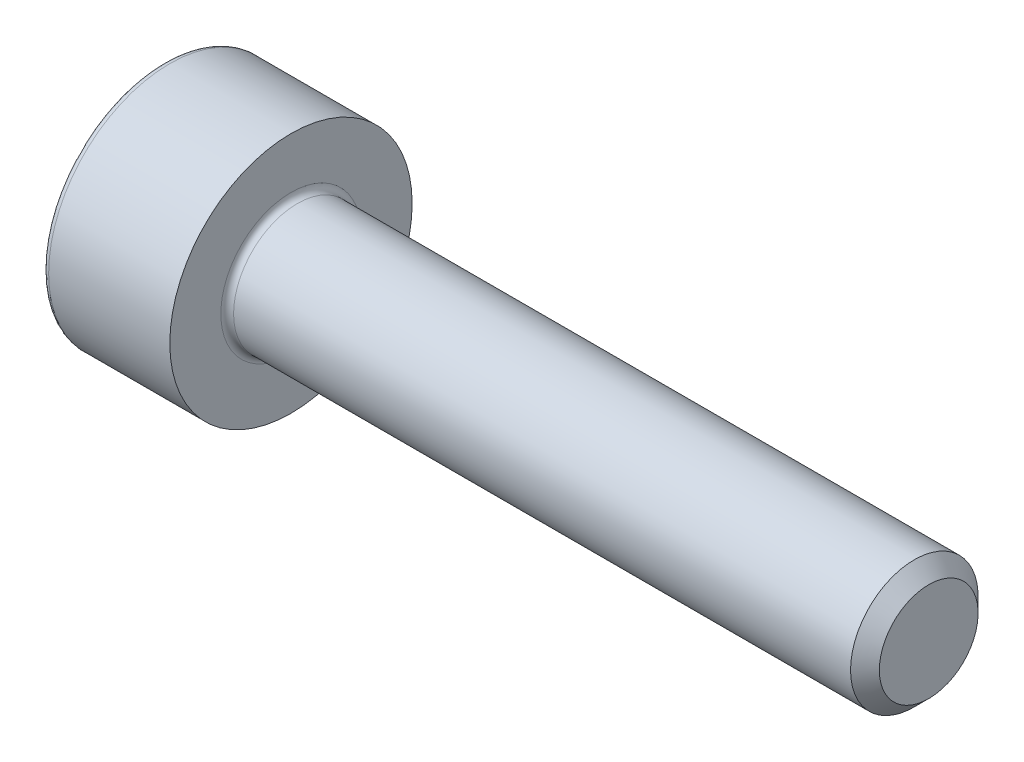
ISO-10303-21;
HEADER;
FILE_DESCRIPTION(('STEP AP214'),'2;1');
FILE_NAME('part.step','',(''),(''),'','','');
FILE_SCHEMA(('AUTOMOTIVE_DESIGN { 1 0 10303 214 1 1 1 1 }'));
ENDSEC;
DATA;
#1=APPLICATION_CONTEXT('core data for automotive mechanical design processes');
#2=APPLICATION_PROTOCOL_DEFINITION('international standard','automotive_design',2000,#1);
#3=PRODUCT_CONTEXT('',#1,'mechanical');
#4=PRODUCT('Part','Part','',(#3));
#5=PRODUCT_RELATED_PRODUCT_CATEGORY('part','',(#4));
#6=PRODUCT_DEFINITION_FORMATION('','',#4);
#7=PRODUCT_DEFINITION_CONTEXT('part definition',#1,'design');
#8=PRODUCT_DEFINITION('design','',#6,#7);
#9=PRODUCT_DEFINITION_SHAPE('','',#8);
#10=(LENGTH_UNIT() NAMED_UNIT(*) SI_UNIT(.MILLI.,.METRE.));
#11=(NAMED_UNIT(*) PLANE_ANGLE_UNIT() SI_UNIT($,.RADIAN.));
#12=(NAMED_UNIT(*) SI_UNIT($,.STERADIAN.) SOLID_ANGLE_UNIT());
#13=UNCERTAINTY_MEASURE_WITH_UNIT(LENGTH_MEASURE(1.E-05),#10,'distance_accuracy_value','');
#14=(GEOMETRIC_REPRESENTATION_CONTEXT(3) GLOBAL_UNCERTAINTY_ASSIGNED_CONTEXT((#13)) GLOBAL_UNIT_ASSIGNED_CONTEXT((#10,
#11,#12)) REPRESENTATION_CONTEXT('',''));
#15=CARTESIAN_POINT('',(0.,0.,0.));
#16=DIRECTION('',(0.,0.,1.));
#17=DIRECTION('',(1.,0.,0.));
#18=AXIS2_PLACEMENT_3D('',#15,#16,#17);
#19=CARTESIAN_POINT('',(0.,0.,0.));
#20=DIRECTION('',(-1.,0.,0.));
#21=DIRECTION('',(0.,0.,1.));
#22=AXIS2_PLACEMENT_3D('',#19,#20,#21);
#23=PLANE('',#22);
#24=DIRECTION('',(0.,-0.499999999999999,0.866025403784439));
#25=VECTOR('',#24,1.);
#26=CARTESIAN_POINT('',(0.,0.892006165897972,0.));
#27=LINE('',#26,#25);
#28=CARTESIAN_POINT('',(0.,0.892006165897972,0.));
#29=VERTEX_POINT('',#28);
#30=CARTESIAN_POINT('',(0.,0.446003082948987,0.772499999999999));
#31=VERTEX_POINT('',#30);
#32=EDGE_CURVE('E479',#29,#31,#27,.T.);
#33=ORIENTED_EDGE('',*,*,#32,.T.);
#34=DIRECTION('',(0.,1.,0.));
#35=VECTOR('',#34,1.);
#36=CARTESIAN_POINT('',(0.,-0.446003082948984,0.7725));
#37=LINE('',#36,#35);
#38=CARTESIAN_POINT('',(0.,-0.446003082948984,0.7725));
#39=VERTEX_POINT('',#38);
#40=EDGE_CURVE('E137',#39,#31,#37,.T.);
#41=ORIENTED_EDGE('',*,*,#40,.F.);
#42=DIRECTION('',(0.,-0.500000000000001,-0.866025403784438));
#43=VECTOR('',#42,1.);
#44=CARTESIAN_POINT('',(0.,-0.446003082948984,0.7725));
#45=LINE('',#44,#43);
#46=CARTESIAN_POINT('',(0.,-0.892006165897971,0.));
#47=VERTEX_POINT('',#46);
#48=EDGE_CURVE('E482',#39,#47,#45,.T.);
#49=ORIENTED_EDGE('',*,*,#48,.T.);
#50=DIRECTION('',(0.,0.499999999999997,-0.86602540378444));
#51=VECTOR('',#50,1.);
#52=CARTESIAN_POINT('',(0.,-0.892006165897971,0.));
#53=LINE('',#52,#51);
#54=CARTESIAN_POINT('',(0.,-0.446003082948987,-0.772500000000001));
#55=VERTEX_POINT('',#54);
#56=EDGE_CURVE('E485',#47,#55,#53,.T.);
#57=ORIENTED_EDGE('',*,*,#56,.T.);
#58=DIRECTION('',(0.,-1.,0.));
#59=VECTOR('',#58,1.);
#60=CARTESIAN_POINT('',(0.,0.446003082948986,-0.772500000000001));
#61=LINE('',#60,#59);
#62=CARTESIAN_POINT('',(0.,0.446003082948986,-0.772500000000001));
#63=VERTEX_POINT('',#62);
#64=EDGE_CURVE('E488',#63,#55,#61,.T.);
#65=ORIENTED_EDGE('',*,*,#64,.F.);
#66=DIRECTION('',(0.,-0.500000000000001,-0.866025403784438));
#67=VECTOR('',#66,1.);
#68=CARTESIAN_POINT('',(0.,0.892006165897972,0.));
#69=LINE('',#68,#67);
#70=EDGE_CURVE('E132',#29,#63,#69,.T.);
#71=ORIENTED_EDGE('',*,*,#70,.F.);
#72=EDGE_LOOP('',(#33,#41,#49,#57,#65,#71));
#73=FACE_BOUND('',#72,.T.);
#74=CARTESIAN_POINT('',(0.,0.,0.));
#75=DIRECTION('',(-1.,0.,0.));
#76=DIRECTION('',(0.,0.,1.));
#77=AXIS2_PLACEMENT_3D('',#74,#75,#76);
#78=CIRCLE('',#77,1.8);
#79=CARTESIAN_POINT('',(0.,0.,1.8));
#80=VERTEX_POINT('',#79);
#81=EDGE_CURVE('E49',#80,#80,#78,.T.);
#82=ORIENTED_EDGE('',*,*,#81,.T.);
#83=EDGE_LOOP('',(#82));
#84=FACE_BOUND('',#83,.T.);
#85=ADVANCED_FACE('F41',(#73,#84),#23,.T.);
#86=CARTESIAN_POINT('',(12.,0.774,0.));
#87=DIRECTION('',(1.,0.,0.));
#88=DIRECTION('',(0.,0.,-1.));
#89=AXIS2_PLACEMENT_3D('',#86,#87,#88);
#90=PLANE('',#89);
#91=CARTESIAN_POINT('',(12.,0.,0.));
#92=DIRECTION('',(-1.,0.,0.));
#93=DIRECTION('',(0.,0.,1.));
#94=AXIS2_PLACEMENT_3D('',#91,#92,#93);
#95=CIRCLE('',#94,0.774);
#96=CARTESIAN_POINT('',(12.,0.,0.774));
#97=VERTEX_POINT('',#96);
#98=EDGE_CURVE('E155',#97,#97,#95,.T.);
#99=ORIENTED_EDGE('',*,*,#98,.F.);
#100=EDGE_LOOP('',(#99));
#101=FACE_BOUND('',#100,.T.);
#102=ADVANCED_FACE('F179',(#101),#90,.T.);
#103=CARTESIAN_POINT('',(12.,0.,0.));
#104=DIRECTION('',(-1.,0.,0.));
#105=DIRECTION('',(0.,0.,1.));
#106=AXIS2_PLACEMENT_3D('',#103,#104,#105);
#107=CONICAL_SURFACE('',#106,0.774,0.785398163397475);
#108=CARTESIAN_POINT('',(11.774,0.,0.));
#109=DIRECTION('',(-1.,0.,0.));
#110=DIRECTION('',(0.,0.,1.));
#111=AXIS2_PLACEMENT_3D('',#108,#109,#110);
#112=CIRCLE('',#111,1.);
#113=CARTESIAN_POINT('',(11.774,0.,1.));
#114=VERTEX_POINT('',#113);
#115=EDGE_CURVE('E152',#114,#114,#112,.T.);
#116=ORIENTED_EDGE('',*,*,#115,.F.);
#117=EDGE_LOOP('',(#116));
#118=FACE_BOUND('',#117,.T.);
#119=ORIENTED_EDGE('',*,*,#98,.T.);
#120=EDGE_LOOP('',(#119));
#121=FACE_BOUND('',#120,.T.);
#122=ADVANCED_FACE('F185',(#118,#121),#107,.T.);
#123=CARTESIAN_POINT('',(-31.75,0.,0.));
#124=DIRECTION('',(-1.,0.,0.));
#125=DIRECTION('',(0.,0.,1.));
#126=AXIS2_PLACEMENT_3D('',#123,#124,#125);
#127=CYLINDRICAL_SURFACE('',#126,1.);
#128=CARTESIAN_POINT('',(2.1,0.,0.));
#129=DIRECTION('',(1.,0.,0.));
#130=DIRECTION('',(0.,0.,-1.));
#131=AXIS2_PLACEMENT_3D('',#128,#129,#130);
#132=CIRCLE('',#131,1.);
#133=CARTESIAN_POINT('',(2.1,0.,-1.));
#134=VERTEX_POINT('',#133);
#135=EDGE_CURVE('E161',#134,#134,#132,.T.);
#136=ORIENTED_EDGE('',*,*,#135,.T.);
#137=EDGE_LOOP('',(#136));
#138=FACE_BOUND('',#137,.T.);
#139=ORIENTED_EDGE('',*,*,#115,.T.);
#140=EDGE_LOOP('',(#139));
#141=FACE_BOUND('',#140,.T.);
#142=ADVANCED_FACE('F197',(#138,#141),#127,.T.);
#143=CARTESIAN_POINT('',(2.00000000000001,1.9,0.));
#144=DIRECTION('',(1.,0.,0.));
#145=DIRECTION('',(0.,0.,-1.));
#146=AXIS2_PLACEMENT_3D('',#143,#144,#145);
#147=PLANE('',#146);
#148=CARTESIAN_POINT('',(2.00000000000001,0.,0.));
#149=DIRECTION('',(1.,0.,0.));
#150=DIRECTION('',(0.,0.,-1.));
#151=AXIS2_PLACEMENT_3D('',#148,#149,#150);
#152=CIRCLE('',#151,1.1);
#153=CARTESIAN_POINT('',(2.00000000000001,0.,-1.1));
#154=VERTEX_POINT('',#153);
#155=EDGE_CURVE('E158',#154,#154,#152,.F.);
#156=ORIENTED_EDGE('',*,*,#155,.T.);
#157=EDGE_LOOP('',(#156));
#158=FACE_BOUND('',#157,.T.);
#159=CARTESIAN_POINT('',(2.,0.,0.));
#160=DIRECTION('',(-1.,0.,0.));
#161=DIRECTION('',(0.,0.,1.));
#162=AXIS2_PLACEMENT_3D('',#159,#160,#161);
#163=CIRCLE('',#162,1.9);
#164=CARTESIAN_POINT('',(2.,0.,1.9));
#165=VERTEX_POINT('',#164);
#166=EDGE_CURVE('E148',#165,#165,#163,.T.);
#167=ORIENTED_EDGE('',*,*,#166,.F.);
#168=EDGE_LOOP('',(#167));
#169=FACE_BOUND('',#168,.T.);
#170=ADVANCED_FACE('F193',(#158,#169),#147,.T.);
#171=CARTESIAN_POINT('',(-31.75,0.,0.));
#172=DIRECTION('',(-1.,0.,0.));
#173=DIRECTION('',(0.,0.,1.));
#174=AXIS2_PLACEMENT_3D('',#171,#172,#173);
#175=CYLINDRICAL_SURFACE('',#174,1.9);
#176=CARTESIAN_POINT('',(0.100000000000003,0.,0.));
#177=DIRECTION('',(-1.,0.,0.));
#178=DIRECTION('',(0.,0.,1.));
#179=AXIS2_PLACEMENT_3D('',#176,#177,#178);
#180=CIRCLE('',#179,1.9);
#181=CARTESIAN_POINT('',(0.100000000000003,0.,1.9));
#182=VERTEX_POINT('',#181);
#183=EDGE_CURVE('E11',#182,#182,#180,.F.);
#184=ORIENTED_EDGE('',*,*,#183,.T.);
#185=EDGE_LOOP('',(#184));
#186=FACE_BOUND('',#185,.T.);
#187=ORIENTED_EDGE('',*,*,#166,.T.);
#188=EDGE_LOOP('',(#187));
#189=FACE_BOUND('',#188,.T.);
#190=ADVANCED_FACE('F175',(#186,#189),#175,.T.);
#191=CARTESIAN_POINT('',(2.1,0.,0.));
#192=DIRECTION('',(1.,0.,0.));
#193=DIRECTION('',(0.,0.,-1.));
#194=AXIS2_PLACEMENT_3D('',#191,#192,#193);
#195=TOROIDAL_SURFACE('',#194,1.1,0.1);
#196=ORIENTED_EDGE('',*,*,#135,.F.);
#197=EDGE_LOOP('',(#196));
#198=FACE_BOUND('',#197,.T.);
#199=ORIENTED_EDGE('',*,*,#155,.F.);
#200=EDGE_LOOP('',(#199));
#201=FACE_BOUND('',#200,.T.);
#202=ADVANCED_FACE('F168',(#198,#201),#195,.F.);
#203=CARTESIAN_POINT('',(0.100000000000003,0.,0.));
#204=DIRECTION('',(-1.,0.,0.));
#205=DIRECTION('',(0.,0.,1.));
#206=AXIS2_PLACEMENT_3D('',#203,#204,#205);
#207=TOROIDAL_SURFACE('',#206,1.8,0.1);
#208=ORIENTED_EDGE('',*,*,#183,.F.);
#209=EDGE_LOOP('',(#208));
#210=FACE_BOUND('',#209,.T.);
#211=ORIENTED_EDGE('',*,*,#81,.F.);
#212=EDGE_LOOP('',(#211));
#213=FACE_BOUND('',#212,.T.);
#214=ADVANCED_FACE('F43',(#210,#213),#207,.T.);
#215=CARTESIAN_POINT('',(1.,0.892006165897972,0.));
#216=DIRECTION('',(0.,-0.866025403784439,-0.499999999999999));
#217=DIRECTION('',(0.,0.499999999999999,-0.866025403784439));
#218=AXIS2_PLACEMENT_3D('',#215,#216,#217);
#219=PLANE('',#218);
#220=ORIENTED_EDGE('',*,*,#32,.F.);
#221=DIRECTION('',(-1.,0.,0.));
#222=VECTOR('',#221,1.);
#223=CARTESIAN_POINT('',(1.,0.892006165897972,0.));
#224=LINE('',#223,#222);
#225=CARTESIAN_POINT('',(1.,0.892006165897972,0.));
#226=VERTEX_POINT('',#225);
#227=EDGE_CURVE('E478',#226,#29,#224,.T.);
#228=ORIENTED_EDGE('',*,*,#227,.F.);
#229=DIRECTION('',(0.,-0.499999999999999,0.866025403784439));
#230=VECTOR('',#229,1.);
#231=CARTESIAN_POINT('',(1.,0.892006165897972,0.));
#232=LINE('',#231,#230);
#233=CARTESIAN_POINT('',(1.,0.669004624423479,0.386249999999999));
#234=VERTEX_POINT('',#233);
#235=EDGE_CURVE('E124',#226,#234,#232,.T.);
#236=ORIENTED_EDGE('',*,*,#235,.T.);
#237=CARTESIAN_POINT('',(1.,0.446003082948987,0.772499999999999));
#238=VERTEX_POINT('',#237);
#239=EDGE_CURVE('E115',#234,#238,#232,.T.);
#240=ORIENTED_EDGE('',*,*,#239,.T.);
#241=DIRECTION('',(-1.,0.,0.));
#242=VECTOR('',#241,1.);
#243=CARTESIAN_POINT('',(1.,0.446003082948987,0.772499999999999));
#244=LINE('',#243,#242);
#245=EDGE_CURVE('E129',#238,#31,#244,.T.);
#246=ORIENTED_EDGE('',*,*,#245,.T.);
#247=EDGE_LOOP('',(#220,#228,#236,#240,#246));
#248=FACE_BOUND('',#247,.T.);
#249=ADVANCED_FACE('F128',(#248),#219,.T.);
#250=CARTESIAN_POINT('',(1.,-0.446003082948984,0.7725));
#251=DIRECTION('',(0.,0.,1.));
#252=DIRECTION('',(0.,-1.,0.));
#253=AXIS2_PLACEMENT_3D('',#250,#251,#252);
#254=PLANE('',#253);
#255=ORIENTED_EDGE('',*,*,#40,.T.);
#256=ORIENTED_EDGE('',*,*,#245,.F.);
#257=DIRECTION('',(0.,1.,0.));
#258=VECTOR('',#257,1.);
#259=CARTESIAN_POINT('',(1.,-0.446003082948984,0.7725));
#260=LINE('',#259,#258);
#261=CARTESIAN_POINT('',(1.,0.,0.772499999999999));
#262=VERTEX_POINT('',#261);
#263=EDGE_CURVE('E112',#262,#238,#260,.T.);
#264=ORIENTED_EDGE('',*,*,#263,.F.);
#265=CARTESIAN_POINT('',(1.,-0.446003082948984,0.7725));
#266=VERTEX_POINT('',#265);
#267=EDGE_CURVE('E123',#266,#262,#260,.T.);
#268=ORIENTED_EDGE('',*,*,#267,.F.);
#269=DIRECTION('',(-1.,0.,0.));
#270=VECTOR('',#269,1.);
#271=CARTESIAN_POINT('',(1.,-0.446003082948984,0.7725));
#272=LINE('',#271,#270);
#273=EDGE_CURVE('E139',#266,#39,#272,.T.);
#274=ORIENTED_EDGE('',*,*,#273,.T.);
#275=EDGE_LOOP('',(#255,#256,#264,#268,#274));
#276=FACE_BOUND('',#275,.T.);
#277=ADVANCED_FACE('F134',(#276),#254,.F.);
#278=CARTESIAN_POINT('',(1.,-0.446003082948984,0.7725));
#279=DIRECTION('',(0.,0.866025403784438,-0.500000000000001));
#280=DIRECTION('',(0.,0.500000000000001,0.866025403784438));
#281=AXIS2_PLACEMENT_3D('',#278,#279,#280);
#282=PLANE('',#281);
#283=ORIENTED_EDGE('',*,*,#48,.F.);
#284=ORIENTED_EDGE('',*,*,#273,.F.);
#285=DIRECTION('',(0.,-0.500000000000001,-0.866025403784438));
#286=VECTOR('',#285,1.);
#287=CARTESIAN_POINT('',(1.,-0.446003082948984,0.7725));
#288=LINE('',#287,#286);
#289=CARTESIAN_POINT('',(1.,-0.669004624423477,0.38625));
#290=VERTEX_POINT('',#289);
#291=EDGE_CURVE('E459',#266,#290,#288,.T.);
#292=ORIENTED_EDGE('',*,*,#291,.T.);
#293=CARTESIAN_POINT('',(1.,-0.892006165897971,0.));
#294=VERTEX_POINT('',#293);
#295=EDGE_CURVE('E461',#290,#294,#288,.T.);
#296=ORIENTED_EDGE('',*,*,#295,.T.);
#297=DIRECTION('',(-1.,0.,0.));
#298=VECTOR('',#297,1.);
#299=CARTESIAN_POINT('',(1.,-0.892006165897971,0.));
#300=LINE('',#299,#298);
#301=EDGE_CURVE('E144',#294,#47,#300,.T.);
#302=ORIENTED_EDGE('',*,*,#301,.T.);
#303=EDGE_LOOP('',(#283,#284,#292,#296,#302));
#304=FACE_BOUND('',#303,.T.);
#305=ADVANCED_FACE('F248',(#304),#282,.T.);
#306=CARTESIAN_POINT('',(1.,-0.892006165897971,0.));
#307=DIRECTION('',(0.,0.86602540378444,0.499999999999997));
#308=DIRECTION('',(0.,-0.499999999999997,0.86602540378444));
#309=AXIS2_PLACEMENT_3D('',#306,#307,#308);
#310=PLANE('',#309);
#311=ORIENTED_EDGE('',*,*,#56,.F.);
#312=ORIENTED_EDGE('',*,*,#301,.F.);
#313=DIRECTION('',(0.,0.499999999999997,-0.86602540378444));
#314=VECTOR('',#313,1.);
#315=CARTESIAN_POINT('',(1.,-0.892006165897971,0.));
#316=LINE('',#315,#314);
#317=CARTESIAN_POINT('',(1.,-0.66900462442348,-0.386249999999998));
#318=VERTEX_POINT('',#317);
#319=EDGE_CURVE('E464',#294,#318,#316,.T.);
#320=ORIENTED_EDGE('',*,*,#319,.T.);
#321=CARTESIAN_POINT('',(1.,-0.446003082948987,-0.772500000000001));
#322=VERTEX_POINT('',#321);
#323=EDGE_CURVE('E468',#318,#322,#316,.T.);
#324=ORIENTED_EDGE('',*,*,#323,.T.);
#325=DIRECTION('',(-1.,0.,0.));
#326=VECTOR('',#325,1.);
#327=CARTESIAN_POINT('',(1.,-0.446003082948987,-0.772500000000001));
#328=LINE('',#327,#326);
#329=EDGE_CURVE('E497',#322,#55,#328,.T.);
#330=ORIENTED_EDGE('',*,*,#329,.T.);
#331=EDGE_LOOP('',(#311,#312,#320,#324,#330));
#332=FACE_BOUND('',#331,.T.);
#333=ADVANCED_FACE('F257',(#332),#310,.T.);
#334=CARTESIAN_POINT('',(1.,0.446003082948986,-0.772500000000001));
#335=DIRECTION('',(0.,0.,-1.));
#336=DIRECTION('',(0.,1.,0.));
#337=AXIS2_PLACEMENT_3D('',#334,#335,#336);
#338=PLANE('',#337);
#339=ORIENTED_EDGE('',*,*,#64,.T.);
#340=ORIENTED_EDGE('',*,*,#329,.F.);
#341=DIRECTION('',(0.,-1.,0.));
#342=VECTOR('',#341,1.);
#343=CARTESIAN_POINT('',(1.,0.446003082948986,-0.772500000000001));
#344=LINE('',#343,#342);
#345=CARTESIAN_POINT('',(1.,0.,-0.772500000000001));
#346=VERTEX_POINT('',#345);
#347=EDGE_CURVE('E472',#346,#322,#344,.T.);
#348=ORIENTED_EDGE('',*,*,#347,.F.);
#349=CARTESIAN_POINT('',(1.,0.446003082948986,-0.772500000000001));
#350=VERTEX_POINT('',#349);
#351=EDGE_CURVE('E56',#350,#346,#344,.T.);
#352=ORIENTED_EDGE('',*,*,#351,.F.);
#353=DIRECTION('',(-1.,0.,0.));
#354=VECTOR('',#353,1.);
#355=CARTESIAN_POINT('',(1.,0.446003082948986,-0.772500000000001));
#356=LINE('',#355,#354);
#357=EDGE_CURVE('E494',#350,#63,#356,.T.);
#358=ORIENTED_EDGE('',*,*,#357,.T.);
#359=EDGE_LOOP('',(#339,#340,#348,#352,#358));
#360=FACE_BOUND('',#359,.T.);
#361=ADVANCED_FACE('F267',(#360),#338,.F.);
#362=CARTESIAN_POINT('',(1.,0.892006165897972,0.));
#363=DIRECTION('',(0.,0.866025403784438,-0.500000000000001));
#364=DIRECTION('',(0.,0.500000000000001,0.866025403784438));
#365=AXIS2_PLACEMENT_3D('',#362,#363,#364);
#366=PLANE('',#365);
#367=ORIENTED_EDGE('',*,*,#70,.T.);
#368=ORIENTED_EDGE('',*,*,#357,.F.);
#369=DIRECTION('',(0.,-0.500000000000001,-0.866025403784438));
#370=VECTOR('',#369,1.);
#371=CARTESIAN_POINT('',(1.,0.892006165897972,0.));
#372=LINE('',#371,#370);
#373=CARTESIAN_POINT('',(1.,0.669004624423479,-0.386250000000001));
#374=VERTEX_POINT('',#373);
#375=EDGE_CURVE('E474',#374,#350,#372,.T.);
#376=ORIENTED_EDGE('',*,*,#375,.F.);
#377=EDGE_CURVE('E475',#226,#374,#372,.T.);
#378=ORIENTED_EDGE('',*,*,#377,.F.);
#379=ORIENTED_EDGE('',*,*,#227,.T.);
#380=EDGE_LOOP('',(#367,#368,#376,#378,#379));
#381=FACE_BOUND('',#380,.T.);
#382=ADVANCED_FACE('F277',(#381),#366,.F.);
#383=CARTESIAN_POINT('',(1.,1.33800924884696,-0.7725));
#384=DIRECTION('',(1.,0.,0.));
#385=DIRECTION('',(0.,0.,-1.));
#386=AXIS2_PLACEMENT_3D('',#383,#384,#385);
#387=PLANE('',#386);
#388=ORIENTED_EDGE('',*,*,#347,.T.);
#389=ORIENTED_EDGE('',*,*,#323,.F.);
#390=CARTESIAN_POINT('',(1.,0.,0.));
#391=DIRECTION('',(-1.,0.,0.));
#392=DIRECTION('',(0.,0.,1.));
#393=AXIS2_PLACEMENT_3D('',#390,#391,#392);
#394=CIRCLE('',#393,0.772500000000001);
#395=EDGE_CURVE('E504',#346,#318,#394,.T.);
#396=ORIENTED_EDGE('',*,*,#395,.F.);
#397=EDGE_LOOP('',(#388,#389,#396));
#398=FACE_BOUND('',#397,.T.);
#399=ADVANCED_FACE('F287',(#398),#387,.F.);
#400=ORIENTED_EDGE('',*,*,#319,.F.);
#401=ORIENTED_EDGE('',*,*,#295,.F.);
#402=EDGE_CURVE('E142',#318,#290,#394,.T.);
#403=ORIENTED_EDGE('',*,*,#402,.F.);
#404=EDGE_LOOP('',(#400,#401,#403));
#405=FACE_BOUND('',#404,.T.);
#406=ADVANCED_FACE('F297',(#405),#387,.F.);
#407=ORIENTED_EDGE('',*,*,#291,.F.);
#408=ORIENTED_EDGE('',*,*,#267,.T.);
#409=EDGE_CURVE('E138',#290,#262,#394,.T.);
#410=ORIENTED_EDGE('',*,*,#409,.F.);
#411=EDGE_LOOP('',(#407,#408,#410));
#412=FACE_BOUND('',#411,.T.);
#413=ADVANCED_FACE('F308',(#412),#387,.F.);
#414=ORIENTED_EDGE('',*,*,#263,.T.);
#415=ORIENTED_EDGE('',*,*,#239,.F.);
#416=EDGE_CURVE('E118',#262,#234,#394,.T.);
#417=ORIENTED_EDGE('',*,*,#416,.F.);
#418=EDGE_LOOP('',(#414,#415,#417));
#419=FACE_BOUND('',#418,.T.);
#420=ADVANCED_FACE('F114',(#419),#387,.F.);
#421=ORIENTED_EDGE('',*,*,#235,.F.);
#422=ORIENTED_EDGE('',*,*,#377,.T.);
#423=EDGE_CURVE('E149',#234,#374,#394,.T.);
#424=ORIENTED_EDGE('',*,*,#423,.F.);
#425=EDGE_LOOP('',(#421,#422,#424));
#426=FACE_BOUND('',#425,.T.);
#427=ADVANCED_FACE('F325',(#426),#387,.F.);
#428=ORIENTED_EDGE('',*,*,#375,.T.);
#429=ORIENTED_EDGE('',*,*,#351,.T.);
#430=EDGE_CURVE('E503',#374,#346,#394,.T.);
#431=ORIENTED_EDGE('',*,*,#430,.F.);
#432=EDGE_LOOP('',(#428,#429,#431));
#433=FACE_BOUND('',#432,.T.);
#434=ADVANCED_FACE('F300',(#433),#387,.F.);
#435=CARTESIAN_POINT('',(1.,0.,0.));
#436=DIRECTION('',(-1.,0.,0.));
#437=DIRECTION('',(0.,0.,1.));
#438=AXIS2_PLACEMENT_3D('',#435,#436,#437);
#439=CONICAL_SURFACE('',#438,0.772500000000001,1.04719755119659);
#440=CARTESIAN_POINT('',(1.446003082949,0.,0.));
#441=VERTEX_POINT('',#440);
#442=VERTEX_LOOP('',#441);
#443=FACE_BOUND('',#442,.T.);
#444=ORIENTED_EDGE('',*,*,#416,.T.);
#445=ORIENTED_EDGE('',*,*,#423,.T.);
#446=ORIENTED_EDGE('',*,*,#430,.T.);
#447=ORIENTED_EDGE('',*,*,#395,.T.);
#448=ORIENTED_EDGE('',*,*,#402,.T.);
#449=ORIENTED_EDGE('',*,*,#409,.T.);
#450=EDGE_LOOP('',(#444,#445,#446,#447,#448,#449));
#451=FACE_BOUND('',#450,.T.);
#452=ADVANCED_FACE('F190',(#443,#451),#439,.F.);
#453=CLOSED_SHELL('',(#85,#102,#122,#142,#170,#190,#202,#214,#249,#277,#305,#333,#361,#382,#399,
#406,#413,#420,#427,#434,#452));
#454=MANIFOLD_SOLID_BREP('B2',#453);
#455=ADVANCED_BREP_SHAPE_REPRESENTATION('',(#18,#454),#14);
#456=SHAPE_DEFINITION_REPRESENTATION(#9,#455);
ENDSEC;
END-ISO-10303-21;
